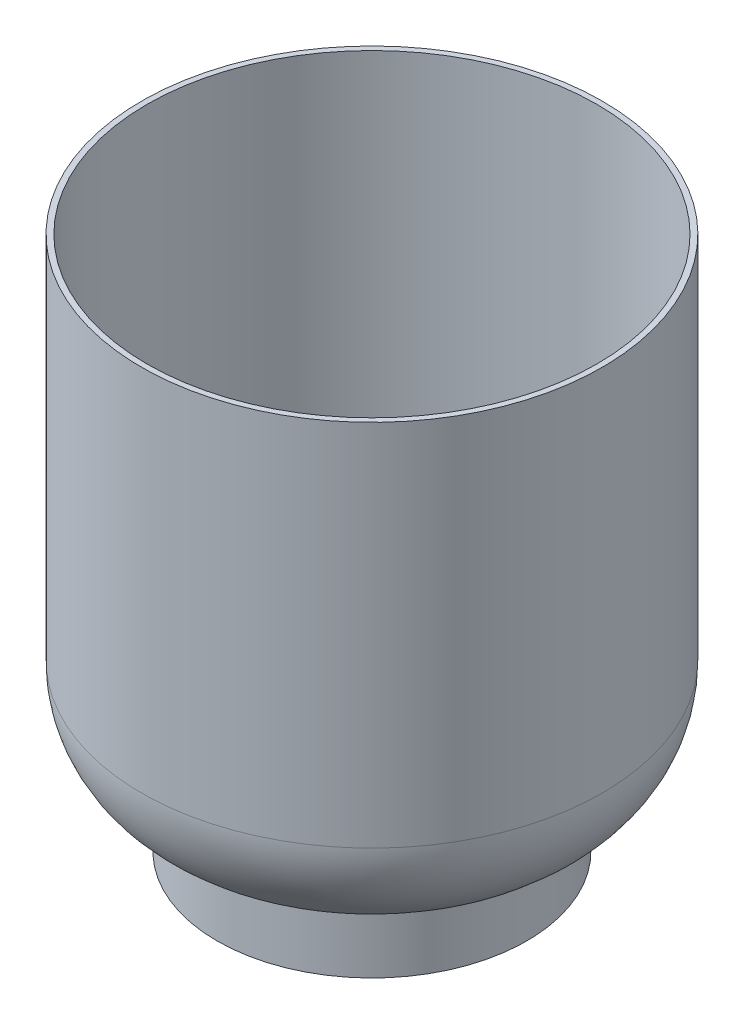
ISO-10303-21;
HEADER;
FILE_DESCRIPTION(('STEP AP214'),'2;1');
FILE_NAME('part.step','',(''),(''),'','','');
FILE_SCHEMA(('AUTOMOTIVE_DESIGN { 1 0 10303 214 1 1 1 1 }'));
ENDSEC;
DATA;
#1=APPLICATION_CONTEXT('core data for automotive mechanical design processes');
#2=APPLICATION_PROTOCOL_DEFINITION('international standard','automotive_design',2000,#1);
#3=PRODUCT_CONTEXT('',#1,'mechanical');
#4=PRODUCT('Part','Part','',(#3));
#5=PRODUCT_RELATED_PRODUCT_CATEGORY('part','',(#4));
#6=PRODUCT_DEFINITION_FORMATION('','',#4);
#7=PRODUCT_DEFINITION_CONTEXT('part definition',#1,'design');
#8=PRODUCT_DEFINITION('design','',#6,#7);
#9=PRODUCT_DEFINITION_SHAPE('','',#8);
#10=(LENGTH_UNIT() NAMED_UNIT(*) SI_UNIT(.MILLI.,.METRE.));
#11=(NAMED_UNIT(*) PLANE_ANGLE_UNIT() SI_UNIT($,.RADIAN.));
#12=(NAMED_UNIT(*) SI_UNIT($,.STERADIAN.) SOLID_ANGLE_UNIT());
#13=UNCERTAINTY_MEASURE_WITH_UNIT(LENGTH_MEASURE(1.E-05),#10,'distance_accuracy_value','');
#14=(GEOMETRIC_REPRESENTATION_CONTEXT(3) GLOBAL_UNCERTAINTY_ASSIGNED_CONTEXT((#13)) GLOBAL_UNIT_ASSIGNED_CONTEXT((#10,
#11,#12)) REPRESENTATION_CONTEXT('',''));
#15=CARTESIAN_POINT('',(0.,0.,0.));
#16=DIRECTION('',(0.,0.,1.));
#17=DIRECTION('',(1.,0.,0.));
#18=AXIS2_PLACEMENT_3D('',#15,#16,#17);
#19=CARTESIAN_POINT('',(-62.5,80.5133493871694,0.));
#20=DIRECTION('',(0.,-1.,0.));
#21=DIRECTION('',(0.,0.,-1.));
#22=AXIS2_PLACEMENT_3D('',#19,#20,#21);
#23=PLANE('',#22);
#24=CARTESIAN_POINT('',(0.,80.5133493871694,0.));
#25=DIRECTION('',(0.,-1.,0.));
#26=DIRECTION('',(0.,0.,-1.));
#27=AXIS2_PLACEMENT_3D('',#24,#25,#26);
#28=CIRCLE('',#27,62.5);
#29=CARTESIAN_POINT('',(0.,80.5133493871694,-62.5));
#30=VERTEX_POINT('',#29);
#31=EDGE_CURVE('E10',#30,#30,#28,.T.);
#32=ORIENTED_EDGE('',*,*,#31,.F.);
#33=EDGE_LOOP('',(#32));
#34=FACE_BOUND('',#33,.T.);
#35=CARTESIAN_POINT('',(0.,80.5133493871694,0.));
#36=DIRECTION('',(0.,-1.,0.));
#37=DIRECTION('',(0.,0.,-1.));
#38=AXIS2_PLACEMENT_3D('',#35,#36,#37);
#39=CIRCLE('',#38,61.);
#40=CARTESIAN_POINT('',(0.,80.5133493871694,-61.));
#41=VERTEX_POINT('',#40);
#42=EDGE_CURVE('E77',#41,#41,#39,.T.);
#43=ORIENTED_EDGE('',*,*,#42,.T.);
#44=EDGE_LOOP('',(#43));
#45=FACE_BOUND('',#44,.T.);
#46=ADVANCED_FACE('F31',(#34,#45),#23,.F.);
#47=CARTESIAN_POINT('',(0.,0.,0.));
#48=DIRECTION('',(0.,-1.,0.));
#49=DIRECTION('',(0.,0.,-1.));
#50=AXIS2_PLACEMENT_3D('',#47,#48,#49);
#51=CYLINDRICAL_SURFACE('',#50,62.5);
#52=CARTESIAN_POINT('',(0.,-19.4866506128306,0.));
#53=DIRECTION('',(0.,-1.,0.));
#54=DIRECTION('',(0.,0.,-1.));
#55=AXIS2_PLACEMENT_3D('',#52,#53,#54);
#56=CIRCLE('',#55,62.5);
#57=CARTESIAN_POINT('',(0.,-19.4866506128306,-62.5));
#58=VERTEX_POINT('',#57);
#59=EDGE_CURVE('E37',#58,#58,#56,.T.);
#60=ORIENTED_EDGE('',*,*,#59,.F.);
#61=EDGE_LOOP('',(#60));
#62=FACE_BOUND('',#61,.T.);
#63=ORIENTED_EDGE('',*,*,#31,.T.);
#64=EDGE_LOOP('',(#63));
#65=FACE_BOUND('',#64,.T.);
#66=ADVANCED_FACE('F150',(#62,#65),#51,.T.);
#67=CARTESIAN_POINT('',(0.,-19.4866506128306,0.));
#68=DIRECTION('',(0.,-1.,0.));
#69=DIRECTION('',(0.,0.,-1.));
#70=AXIS2_PLACEMENT_3D('',#67,#68,#69);
#71=TOROIDAL_SURFACE('',#70,32.5,30.);
#72=CARTESIAN_POINT('',(0.,-47.5980261235838,0.));
#73=DIRECTION('',(0.,-1.,0.));
#74=DIRECTION('',(0.,0.,-1.));
#75=AXIS2_PLACEMENT_3D('',#72,#73,#74);
#76=CIRCLE('',#75,42.9761904761905);
#77=CARTESIAN_POINT('',(0.,-47.5980261235838,-42.9761904761905));
#78=VERTEX_POINT('',#77);
#79=EDGE_CURVE('E41',#78,#78,#76,.T.);
#80=ORIENTED_EDGE('',*,*,#79,.F.);
#81=EDGE_LOOP('',(#80));
#82=FACE_BOUND('',#81,.T.);
#83=ORIENTED_EDGE('',*,*,#59,.T.);
#84=EDGE_LOOP('',(#83));
#85=FACE_BOUND('',#84,.T.);
#86=ADVANCED_FACE('F145',(#82,#85),#71,.T.);
#87=CARTESIAN_POINT('',(0.,-49.0035948991214,0.));
#88=DIRECTION('',(0.,-1.,0.));
#89=DIRECTION('',(0.,0.,-1.));
#90=AXIS2_PLACEMENT_3D('',#87,#88,#89);
#91=TOROIDAL_SURFACE('',#90,43.5,1.50000000000001);
#92=CARTESIAN_POINT('',(0.,-49.0035948991214,0.));
#93=DIRECTION('',(0.,-1.,0.));
#94=DIRECTION('',(0.,0.,-1.));
#95=AXIS2_PLACEMENT_3D('',#92,#93,#94);
#96=CIRCLE('',#95,42.);
#97=CARTESIAN_POINT('',(0.,-49.0035948991214,-42.));
#98=VERTEX_POINT('',#97);
#99=EDGE_CURVE('E45',#98,#98,#96,.T.);
#100=ORIENTED_EDGE('',*,*,#99,.F.);
#101=EDGE_LOOP('',(#100));
#102=FACE_BOUND('',#101,.T.);
#103=ORIENTED_EDGE('',*,*,#79,.T.);
#104=EDGE_LOOP('',(#103));
#105=FACE_BOUND('',#104,.T.);
#106=ADVANCED_FACE('F139',(#102,#105),#91,.F.);
#107=CARTESIAN_POINT('',(0.,0.,0.));
#108=DIRECTION('',(0.,-1.,0.));
#109=DIRECTION('',(0.,0.,-1.));
#110=AXIS2_PLACEMENT_3D('',#107,#108,#109);
#111=CYLINDRICAL_SURFACE('',#110,42.);
#112=CARTESIAN_POINT('',(0.,-64.4866506128306,0.));
#113=DIRECTION('',(0.,-1.,0.));
#114=DIRECTION('',(0.,0.,-1.));
#115=AXIS2_PLACEMENT_3D('',#112,#113,#114);
#116=CIRCLE('',#115,42.);
#117=CARTESIAN_POINT('',(0.,-64.4866506128306,-42.));
#118=VERTEX_POINT('',#117);
#119=EDGE_CURVE('E50',#118,#118,#116,.T.);
#120=ORIENTED_EDGE('',*,*,#119,.F.);
#121=EDGE_LOOP('',(#120));
#122=FACE_BOUND('',#121,.T.);
#123=ORIENTED_EDGE('',*,*,#99,.T.);
#124=EDGE_LOOP('',(#123));
#125=FACE_BOUND('',#124,.T.);
#126=ADVANCED_FACE('F133',(#122,#125),#111,.T.);
#127=CARTESIAN_POINT('',(-42.,-64.4866506128306,0.));
#128=DIRECTION('',(0.,1.,0.));
#129=DIRECTION('',(0.,0.,1.));
#130=AXIS2_PLACEMENT_3D('',#127,#128,#129);
#131=PLANE('',#130);
#132=CARTESIAN_POINT('',(0.,-64.4866506128306,0.));
#133=DIRECTION('',(0.,-1.,0.));
#134=DIRECTION('',(0.,0.,-1.));
#135=AXIS2_PLACEMENT_3D('',#132,#133,#134);
#136=CIRCLE('',#135,40.5);
#137=CARTESIAN_POINT('',(0.,-64.4866506128306,-40.5));
#138=VERTEX_POINT('',#137);
#139=EDGE_CURVE('E53',#138,#138,#136,.T.);
#140=ORIENTED_EDGE('',*,*,#139,.F.);
#141=EDGE_LOOP('',(#140));
#142=FACE_BOUND('',#141,.T.);
#143=ORIENTED_EDGE('',*,*,#119,.T.);
#144=EDGE_LOOP('',(#143));
#145=FACE_BOUND('',#144,.T.);
#146=ADVANCED_FACE('F127',(#142,#145),#131,.F.);
#147=CARTESIAN_POINT('',(0.,0.,0.));
#148=DIRECTION('',(0.,-1.,0.));
#149=DIRECTION('',(0.,0.,-1.));
#150=AXIS2_PLACEMENT_3D('',#147,#148,#149);
#151=CYLINDRICAL_SURFACE('',#150,40.5);
#152=CARTESIAN_POINT('',(0.,-58.4866506128306,0.));
#153=DIRECTION('',(0.,-1.,0.));
#154=DIRECTION('',(0.,0.,-1.));
#155=AXIS2_PLACEMENT_3D('',#152,#153,#154);
#156=CIRCLE('',#155,40.5);
#157=CARTESIAN_POINT('',(0.,-58.4866506128306,-40.5));
#158=VERTEX_POINT('',#157);
#159=EDGE_CURVE('E56',#158,#158,#156,.T.);
#160=ORIENTED_EDGE('',*,*,#159,.F.);
#161=EDGE_LOOP('',(#160));
#162=FACE_BOUND('',#161,.T.);
#163=ORIENTED_EDGE('',*,*,#139,.T.);
#164=EDGE_LOOP('',(#163));
#165=FACE_BOUND('',#164,.T.);
#166=ADVANCED_FACE('F121',(#162,#165),#151,.F.);
#167=CARTESIAN_POINT('',(-40.5,-58.4866506128306,0.));
#168=DIRECTION('',(0.,1.,0.));
#169=DIRECTION('',(0.,0.,1.));
#170=AXIS2_PLACEMENT_3D('',#167,#168,#169);
#171=PLANE('',#170);
#172=CARTESIAN_POINT('',(0.,-58.4866506128306,0.));
#173=DIRECTION('',(0.,-1.,0.));
#174=DIRECTION('',(0.,0.,-1.));
#175=AXIS2_PLACEMENT_3D('',#172,#173,#174);
#176=CIRCLE('',#175,34.5);
#177=CARTESIAN_POINT('',(0.,-58.4866506128306,-34.5));
#178=VERTEX_POINT('',#177);
#179=EDGE_CURVE('E59',#178,#178,#176,.T.);
#180=ORIENTED_EDGE('',*,*,#179,.F.);
#181=EDGE_LOOP('',(#180));
#182=FACE_BOUND('',#181,.T.);
#183=ORIENTED_EDGE('',*,*,#159,.T.);
#184=EDGE_LOOP('',(#183));
#185=FACE_BOUND('',#184,.T.);
#186=ADVANCED_FACE('F115',(#182,#185),#171,.F.);
#187=CARTESIAN_POINT('',(0.,0.,0.));
#188=DIRECTION('',(0.,-1.,0.));
#189=DIRECTION('',(0.,0.,-1.));
#190=AXIS2_PLACEMENT_3D('',#187,#188,#189);
#191=CYLINDRICAL_SURFACE('',#190,34.5);
#192=CARTESIAN_POINT('',(0.,-54.4866506128306,0.));
#193=DIRECTION('',(0.,-1.,0.));
#194=DIRECTION('',(0.,0.,-1.));
#195=AXIS2_PLACEMENT_3D('',#192,#193,#194);
#196=CIRCLE('',#195,34.5);
#197=CARTESIAN_POINT('',(0.,-54.4866506128306,-34.5));
#198=VERTEX_POINT('',#197);
#199=EDGE_CURVE('E62',#198,#198,#196,.T.);
#200=ORIENTED_EDGE('',*,*,#199,.F.);
#201=EDGE_LOOP('',(#200));
#202=FACE_BOUND('',#201,.T.);
#203=ORIENTED_EDGE('',*,*,#179,.T.);
#204=EDGE_LOOP('',(#203));
#205=FACE_BOUND('',#204,.T.);
#206=ADVANCED_FACE('F109',(#202,#205),#191,.F.);
#207=CARTESIAN_POINT('',(-34.5,-54.4866506128306,0.));
#208=DIRECTION('',(0.,-1.,0.));
#209=DIRECTION('',(0.,0.,-1.));
#210=AXIS2_PLACEMENT_3D('',#207,#208,#209);
#211=PLANE('',#210);
#212=CARTESIAN_POINT('',(0.,-54.4866506128306,0.));
#213=DIRECTION('',(0.,-1.,0.));
#214=DIRECTION('',(0.,0.,-1.));
#215=AXIS2_PLACEMENT_3D('',#212,#213,#214);
#216=CIRCLE('',#215,40.5);
#217=CARTESIAN_POINT('',(0.,-54.4866506128306,-40.5));
#218=VERTEX_POINT('',#217);
#219=EDGE_CURVE('E65',#218,#218,#216,.T.);
#220=ORIENTED_EDGE('',*,*,#219,.F.);
#221=EDGE_LOOP('',(#220));
#222=FACE_BOUND('',#221,.T.);
#223=ORIENTED_EDGE('',*,*,#199,.T.);
#224=EDGE_LOOP('',(#223));
#225=FACE_BOUND('',#224,.T.);
#226=ADVANCED_FACE('F103',(#222,#225),#211,.F.);
#227=CARTESIAN_POINT('',(0.,0.,0.));
#228=DIRECTION('',(0.,-1.,0.));
#229=DIRECTION('',(0.,0.,-1.));
#230=AXIS2_PLACEMENT_3D('',#227,#228,#229);
#231=CYLINDRICAL_SURFACE('',#230,40.5);
#232=CARTESIAN_POINT('',(0.,-47.9427571630949,0.));
#233=DIRECTION('',(0.,-1.,0.));
#234=DIRECTION('',(0.,0.,-1.));
#235=AXIS2_PLACEMENT_3D('',#232,#233,#234);
#236=CIRCLE('',#235,40.5);
#237=CARTESIAN_POINT('',(0.,-47.9427571630949,-40.5));
#238=VERTEX_POINT('',#237);
#239=EDGE_CURVE('E68',#238,#238,#236,.T.);
#240=ORIENTED_EDGE('',*,*,#239,.F.);
#241=EDGE_LOOP('',(#240));
#242=FACE_BOUND('',#241,.T.);
#243=ORIENTED_EDGE('',*,*,#219,.T.);
#244=EDGE_LOOP('',(#243));
#245=FACE_BOUND('',#244,.T.);
#246=ADVANCED_FACE('F97',(#242,#245),#231,.F.);
#247=CARTESIAN_POINT('',(0.,-47.9427571630949,0.));
#248=DIRECTION('',(0.,-1.,0.));
#249=DIRECTION('',(0.,0.,-1.));
#250=AXIS2_PLACEMENT_3D('',#247,#248,#249);
#251=TOROIDAL_SURFACE('',#250,42.,1.5);
#252=CARTESIAN_POINT('',(0.,-46.5199518355817,0.));
#253=DIRECTION('',(0.,-1.,0.));
#254=DIRECTION('',(0.,0.,-1.));
#255=AXIS2_PLACEMENT_3D('',#252,#253,#254);
#256=CIRCLE('',#255,41.525);
#257=CARTESIAN_POINT('',(0.,-46.5199518355817,-41.525));
#258=VERTEX_POINT('',#257);
#259=EDGE_CURVE('E71',#258,#258,#256,.T.);
#260=ORIENTED_EDGE('',*,*,#259,.F.);
#261=EDGE_LOOP('',(#260));
#262=FACE_BOUND('',#261,.T.);
#263=ORIENTED_EDGE('',*,*,#239,.T.);
#264=EDGE_LOOP('',(#263));
#265=FACE_BOUND('',#264,.T.);
#266=ADVANCED_FACE('F91',(#262,#265),#251,.T.);
#267=CARTESIAN_POINT('',(0.,-19.4866506128306,0.));
#268=DIRECTION('',(0.,-1.,0.));
#269=DIRECTION('',(0.,0.,-1.));
#270=AXIS2_PLACEMENT_3D('',#267,#268,#269);
#271=TOROIDAL_SURFACE('',#270,32.5,28.5);
#272=CARTESIAN_POINT('',(0.,-19.4866506128306,0.));
#273=DIRECTION('',(0.,-1.,0.));
#274=DIRECTION('',(0.,0.,-1.));
#275=AXIS2_PLACEMENT_3D('',#272,#273,#274);
#276=CIRCLE('',#275,61.);
#277=CARTESIAN_POINT('',(0.,-19.4866506128306,-61.));
#278=VERTEX_POINT('',#277);
#279=EDGE_CURVE('E74',#278,#278,#276,.T.);
#280=ORIENTED_EDGE('',*,*,#279,.F.);
#281=EDGE_LOOP('',(#280));
#282=FACE_BOUND('',#281,.T.);
#283=ORIENTED_EDGE('',*,*,#259,.T.);
#284=EDGE_LOOP('',(#283));
#285=FACE_BOUND('',#284,.T.);
#286=ADVANCED_FACE('F85',(#282,#285),#271,.F.);
#287=CARTESIAN_POINT('',(0.,0.,0.));
#288=DIRECTION('',(0.,-1.,0.));
#289=DIRECTION('',(0.,0.,-1.));
#290=AXIS2_PLACEMENT_3D('',#287,#288,#289);
#291=CYLINDRICAL_SURFACE('',#290,61.);
#292=ORIENTED_EDGE('',*,*,#42,.F.);
#293=EDGE_LOOP('',(#292));
#294=FACE_BOUND('',#293,.T.);
#295=ORIENTED_EDGE('',*,*,#279,.T.);
#296=EDGE_LOOP('',(#295));
#297=FACE_BOUND('',#296,.T.);
#298=ADVANCED_FACE('F82',(#294,#297),#291,.F.);
#299=CLOSED_SHELL('',(#46,#66,#86,#106,#126,#146,#166,#186,#206,#226,#246,#266,#286,#298));
#300=MANIFOLD_SOLID_BREP('B2',#299);
#301=ADVANCED_BREP_SHAPE_REPRESENTATION('',(#18,#300),#14);
#302=SHAPE_DEFINITION_REPRESENTATION(#9,#301);
ENDSEC;
END-ISO-10303-21;
